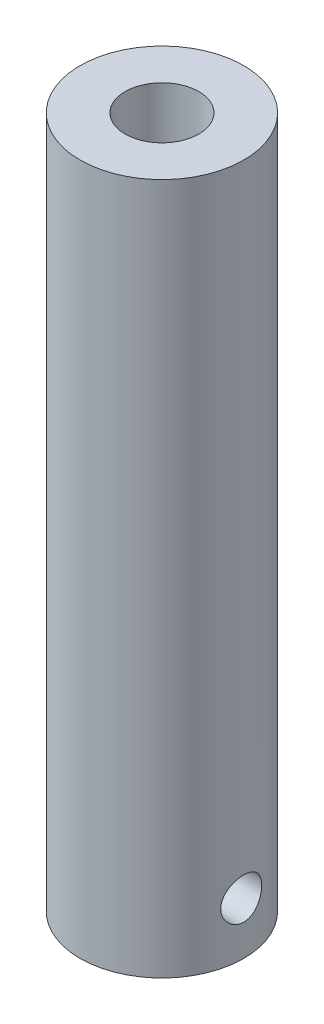
ISO-10303-21;
HEADER;
FILE_DESCRIPTION(('STEP AP214'),'2;1');
FILE_NAME('part.step','',(''),(''),'','','');
FILE_SCHEMA(('AUTOMOTIVE_DESIGN { 1 0 10303 214 1 1 1 1 }'));
ENDSEC;
DATA;
#1=APPLICATION_CONTEXT('core data for automotive mechanical design processes');
#2=APPLICATION_PROTOCOL_DEFINITION('international standard','automotive_design',2000,#1);
#3=PRODUCT_CONTEXT('',#1,'mechanical');
#4=PRODUCT('Part','Part','',(#3));
#5=PRODUCT_RELATED_PRODUCT_CATEGORY('part','',(#4));
#6=PRODUCT_DEFINITION_FORMATION('','',#4);
#7=PRODUCT_DEFINITION_CONTEXT('part definition',#1,'design');
#8=PRODUCT_DEFINITION('design','',#6,#7);
#9=PRODUCT_DEFINITION_SHAPE('','',#8);
#10=(LENGTH_UNIT() NAMED_UNIT(*) SI_UNIT(.MILLI.,.METRE.));
#11=(NAMED_UNIT(*) PLANE_ANGLE_UNIT() SI_UNIT($,.RADIAN.));
#12=(NAMED_UNIT(*) SI_UNIT($,.STERADIAN.) SOLID_ANGLE_UNIT());
#13=UNCERTAINTY_MEASURE_WITH_UNIT(LENGTH_MEASURE(1.E-05),#10,'distance_accuracy_value','');
#14=(GEOMETRIC_REPRESENTATION_CONTEXT(3) GLOBAL_UNCERTAINTY_ASSIGNED_CONTEXT((#13)) GLOBAL_UNIT_ASSIGNED_CONTEXT((#10,
#11,#12)) REPRESENTATION_CONTEXT('',''));
#15=CARTESIAN_POINT('',(0.,0.,0.));
#16=DIRECTION('',(0.,0.,1.));
#17=DIRECTION('',(1.,0.,0.));
#18=AXIS2_PLACEMENT_3D('',#15,#16,#17);
#19=CARTESIAN_POINT('',(0.,16.9,0.));
#20=DIRECTION('',(0.,-1.,0.));
#21=DIRECTION('',(0.,0.,-1.));
#22=AXIS2_PLACEMENT_3D('',#19,#20,#21);
#23=CYLINDRICAL_SURFACE('',#22,2.);
#24=CARTESIAN_POINT('',(-2.,0.76886534867765,0.));
#25=CARTESIAN_POINT('',(-1.99999953289338,0.768866123923703,-0.0276253628899104));
#26=CARTESIAN_POINT('',(-1.99942192710609,0.771162532268913,-0.0552593859435878));
#27=CARTESIAN_POINT('',(-1.99717371276631,0.780273732446652,-0.109735441256844));
#28=CARTESIAN_POINT('',(-1.99550248473323,0.787091085190266,-0.13657701562358));
#29=CARTESIAN_POINT('',(-1.99125208777347,0.805011766498346,-0.188673624060859));
#30=CARTESIAN_POINT('',(-1.98867400947362,0.816109948249409,-0.213930521143334));
#31=CARTESIAN_POINT('',(-1.98288447935864,0.842259145359261,-0.262224043968142));
#32=CARTESIAN_POINT('',(-1.97967300618017,0.857310294050629,-0.28526059478292));
#33=CARTESIAN_POINT('',(-1.97289137863934,0.891265611895721,-0.328933975766973));
#34=CARTESIAN_POINT('',(-1.96931569049511,0.910235873664043,-0.34951856335369));
#35=CARTESIAN_POINT('',(-1.96224540039176,0.951349416980623,-0.387249642401101));
#36=CARTESIAN_POINT('',(-1.95875080762783,0.973493056326483,-0.404395745649712));
#37=CARTESIAN_POINT('',(-1.9521825856657,1.0207304242568,-0.435008847599677));
#38=CARTESIAN_POINT('',(-1.94911598156868,1.04586309228112,-0.448417405308452));
#39=CARTESIAN_POINT('',(-1.94383164937408,1.09811481923044,-0.470798969516842));
#40=CARTESIAN_POINT('',(-1.94161378557596,1.12523355978624,-0.479772685146444));
#41=CARTESIAN_POINT('',(-1.93833492239184,1.18011318141181,-0.492851612268097));
#42=CARTESIAN_POINT('',(-1.93725163691809,1.20785031402758,-0.497050756111113));
#43=CARTESIAN_POINT('',(-1.9362978751258,1.26365487168231,-0.500753925022617));
#44=CARTESIAN_POINT('',(-1.93642720149548,1.29172224224385,-0.500258713939326));
#45=CARTESIAN_POINT('',(-1.93786401832206,1.34667061792581,-0.49466217487976));
#46=CARTESIAN_POINT('',(-1.93914287667293,1.37356388916602,-0.489672780063507));
#47=CARTESIAN_POINT('',(-1.94268903225495,1.42611903231475,-0.475408062301036));
#48=CARTESIAN_POINT('',(-1.94495639990232,1.45178081635398,-0.466132434023141));
#49=CARTESIAN_POINT('',(-1.95025037968062,1.50144468742834,-0.443463159312385));
#50=CARTESIAN_POINT('',(-1.95328442489807,1.52542740594083,-0.430028889077637));
#51=CARTESIAN_POINT('',(-1.95976570282129,1.57083825192993,-0.399452092004985));
#52=CARTESIAN_POINT('',(-1.96321300778245,1.59226593136674,-0.382308916269613));
#53=CARTESIAN_POINT('',(-1.9702529351326,1.63259988724245,-0.344221141560406));
#54=CARTESIAN_POINT('',(-1.9738468982599,1.65141684536477,-0.323182086055287));
#55=CARTESIAN_POINT('',(-1.98068655192929,1.68527242949895,-0.278203972501233));
#56=CARTESIAN_POINT('',(-1.98393223183138,1.70031094009884,-0.254264825902648));
#57=CARTESIAN_POINT('',(-1.98972577364727,1.72621554408578,-0.204038629560464));
#58=CARTESIAN_POINT('',(-1.99227120042575,1.73706712876246,-0.177743797736208));
#59=CARTESIAN_POINT('',(-1.99635972330473,1.75417111724751,-0.123625336047628));
#60=CARTESIAN_POINT('',(-1.99790301113094,1.76042440081703,-0.0958019997168283));
#61=CARTESIAN_POINT('',(-1.99978499757125,1.7680178705306,-0.040179990130009));
#62=CARTESIAN_POINT('',(-2.00015351169426,1.76947969070275,-0.0123989066627367));
#63=CARTESIAN_POINT('',(-1.9997293493815,1.76778234799249,0.0430109582671693));
#64=CARTESIAN_POINT('',(-1.99893677747282,1.76462360107794,0.0706397532148649));
#65=CARTESIAN_POINT('',(-1.99629860375786,1.75387504588052,0.124538089592164));
#66=CARTESIAN_POINT('',(-1.99446878061937,1.74635159418532,0.150821706322918));
#67=CARTESIAN_POINT('',(-1.98996235544711,1.72716298733483,0.201752430817504));
#68=CARTESIAN_POINT('',(-1.98728566789964,1.71549741390659,0.226399373010878));
#69=CARTESIAN_POINT('',(-1.98131102642103,1.68811997238607,0.273841044809949));
#70=CARTESIAN_POINT('',(-1.97800289122311,1.67233997787873,0.29659514727861));
#71=CARTESIAN_POINT('',(-1.97114836395806,1.63726871241199,0.339175537881082));
#72=CARTESIAN_POINT('',(-1.96760193083902,1.61797683547201,0.359001319657669));
#73=CARTESIAN_POINT('',(-1.96056318986924,1.57586469506283,0.39566352269091));
#74=CARTESIAN_POINT('',(-1.95707434729094,1.55296944767684,0.412414622540677));
#75=CARTESIAN_POINT('',(-1.95064292792413,1.50462113718908,0.441836919670899));
#76=CARTESIAN_POINT('',(-1.94770032689009,1.47916818769107,0.454508298052645));
#77=CARTESIAN_POINT('',(-1.94272698244888,1.42656344120662,0.475317140203097));
#78=CARTESIAN_POINT('',(-1.94069085097302,1.39942280589631,0.483481465551355));
#79=CARTESIAN_POINT('',(-1.93775581363394,1.34409546938128,0.495115219984593));
#80=CARTESIAN_POINT('',(-1.93685665906645,1.31590899833349,0.498585675826219));
#81=CARTESIAN_POINT('',(-1.93631633734652,1.26015834072592,0.500679530111331));
#82=CARTESIAN_POINT('',(-1.93663977576088,1.23259953696941,0.499439299260039));
#83=CARTESIAN_POINT('',(-1.93842636335948,1.17809738578832,0.492459092770956));
#84=CARTESIAN_POINT('',(-1.93988948963952,1.15115402600643,0.486719207562256));
#85=CARTESIAN_POINT('',(-1.94377086894241,1.09879586232251,0.470977106480931));
#86=CARTESIAN_POINT('',(-1.94618338412103,1.07337291359758,0.461000468226792));
#87=CARTESIAN_POINT('',(-1.95169251908276,1.02454355443975,0.437088304535024));
#88=CARTESIAN_POINT('',(-1.95478923373591,1.00113742428201,0.423152230011396));
#89=CARTESIAN_POINT('',(-1.96141878087837,0.95634713901031,0.391289249545712));
#90=CARTESIAN_POINT('',(-1.96496088277252,0.935031657536331,0.373267720970752));
#91=CARTESIAN_POINT('',(-1.97202675748762,0.895683000412515,0.333929790396579));
#92=CARTESIAN_POINT('',(-1.97555052575687,0.877650605306661,0.312612607087049));
#93=CARTESIAN_POINT('',(-1.98225885215888,0.845061579156115,0.266822528900863));
#94=CARTESIAN_POINT('',(-1.98543611121956,0.830573810787124,0.242299474105462));
#95=CARTESIAN_POINT('',(-1.99101641658373,0.805949527697474,0.191088686503492));
#96=CARTESIAN_POINT('',(-1.9934200173326,0.795809895128138,0.16440252114558));
#97=CARTESIAN_POINT('',(-1.99682686521847,0.781674738567766,0.114803417747824));
#98=CARTESIAN_POINT('',(-1.9980086168423,0.776881600993172,0.0921267236360227));
#99=CARTESIAN_POINT('',(-1.99959535077316,0.77047670080367,0.0463020238454276));
#100=CARTESIAN_POINT('',(-2.00000039150298,0.768864698909216,0.0231540537475387));
#101=CARTESIAN_POINT('',(-2.,0.76886534867765,0.));
#102=B_SPLINE_CURVE_WITH_KNOTS('',3,(#24,#25,#26,#27,#28,#29,#30,#31,#32,#33,#34,#35,#36,#37,
#38,#39,#40,#41,#42,#43,#44,#45,#46,#47,#48,#49,#50,#51,#52,#53,#54,#55,#56,#57,#58,#59,#60,#61,
#62,#63,#64,#65,#66,#67,#68,#69,#70,#71,#72,#73,#74,#75,#76,#77,#78,#79,#80,#81,#82,#83,#84,#85,
#86,#87,#88,#89,#90,#91,#92,#93,#94,#95,#96,#97,#98,#99,#100,#101),.UNSPECIFIED.,.T.,.F.,(4,2,2,
2,2,2,2,2,2,2,2,2,2,2,2,2,2,2,2,2,2,2,2,2,2,2,2,2,2,2,2,2,2,2,2,2,2,2,4),(0.,0.0827912374906299,
0.165629412587966,0.248368300762035,0.331109980056442,0.41538145145713,0.499662431933539,
0.585195491819356,0.670714870564561,0.754520983664768,0.838313460375656,0.920074990023393,
1.00184234488679,1.08443509291293,1.16704230278721,1.25200500323006,1.33697029852749,
1.42222743003038,1.50746824562881,1.59052769649759,1.67357967037581,1.75540091504679,
1.83723042440763,1.92051195855117,2.0038078766934,2.08914836401492,2.17448506249836,
2.25930751538012,2.34411141084136,2.42647926799537,2.50884546985345,2.59072133519816,
2.67260856045634,2.75663192136637,2.84067523256806,2.92624061833196,3.01174454607117,
3.08114080980716,3.1505318534768),.UNSPECIFIED.);
#103=CARTESIAN_POINT('',(-2.,0.76886534867765,0.));
#104=VERTEX_POINT('',#103);
#105=EDGE_CURVE('E10',#104,#104,#102,.T.);
#106=ORIENTED_EDGE('',*,*,#105,.T.);
#107=EDGE_LOOP('',(#106));
#108=FACE_BOUND('',#107,.T.);
#109=CARTESIAN_POINT('',(1.93649167310371,1.26886534867765,-0.5));
#110=CARTESIAN_POINT('',(1.93649220028592,1.24125519849926,-0.49999921571935));
#111=CARTESIAN_POINT('',(1.93708861249639,1.21363636896197,-0.497705249104035));
#112=CARTESIAN_POINT('',(1.93940372446125,1.15919183306134,-0.488604625097223));
#113=CARTESIAN_POINT('',(1.9411230773709,1.13236659778767,-0.481795341349039));
#114=CARTESIAN_POINT('',(1.94547744906506,1.08030464103373,-0.463898239924817));
#115=CARTESIAN_POINT('',(1.9481112853468,1.05506591759877,-0.452815945570472));
#116=CARTESIAN_POINT('',(1.95399638409164,1.00680317817141,-0.426704228252703));
#117=CARTESIAN_POINT('',(1.9572476727662,0.983779256262077,-0.411674637712252));
#118=CARTESIAN_POINT('',(1.96408143270184,0.940093019624728,-0.377741685462259));
#119=CARTESIAN_POINT('',(1.96766919524355,0.919486628607513,-0.358767377540779));
#120=CARTESIAN_POINT('',(1.97472575103311,0.881713069805711,-0.317636412820164));
#121=CARTESIAN_POINT('',(1.97819453313346,0.864546223553336,-0.29547945883607));
#122=CARTESIAN_POINT('',(1.98468083104048,0.83391025515136,-0.248229040215782));
#123=CARTESIAN_POINT('',(1.987691374801,0.820496071045348,-0.223098915239022));
#124=CARTESIAN_POINT('',(1.99286162385215,0.798103419847043,-0.170852636858555));
#125=CARTESIAN_POINT('',(1.99502145466874,0.78912429829455,-0.143736777158389));
#126=CARTESIAN_POINT('',(1.99820951769631,0.776035781761931,-0.088871751750832));
#127=CARTESIAN_POINT('',(1.99925978768862,0.771831419812333,-0.0611465439097952));
#128=CARTESIAN_POINT('',(2.00018718821461,0.76811367282254,-0.00536576385255426));
#129=CARTESIAN_POINT('',(2.00006449219341,0.768599594235731,0.0226897589076134));
#130=CARTESIAN_POINT('',(1.99867618990707,0.774180318727679,0.0776761235861935));
#131=CARTESIAN_POINT('',(1.99743600468175,0.779172613688421,0.104618107800533));
#132=CARTESIAN_POINT('',(1.99398167304971,0.79345960268735,0.157269123706843));
#133=CARTESIAN_POINT('',(1.99176747479688,0.802754525753132,0.182978089685219));
#134=CARTESIAN_POINT('',(1.98657501940179,0.825465862815063,0.232703351750903));
#135=CARTESIAN_POINT('',(1.98359003939011,0.83891875761,0.256702254883252));
#136=CARTESIAN_POINT('',(1.9771798076193,0.869536484500902,0.302137811170244));
#137=CARTESIAN_POINT('',(1.97375447930498,0.886701962389774,0.323574017542753));
#138=CARTESIAN_POINT('',(1.96672742753904,0.924807097074125,0.363887017542478));
#139=CARTESIAN_POINT('',(1.96312343905184,0.945836327147205,0.382678839537599));
#140=CARTESIAN_POINT('',(1.95623008703341,0.9907853433857,0.416488187981509));
#141=CARTESIAN_POINT('',(1.95294073821194,1.01470526457585,0.431505538023008));
#142=CARTESIAN_POINT('',(1.9470409936633,1.06492335550744,0.457394064511299));
#143=CARTESIAN_POINT('',(1.94443396745144,1.09123249474029,0.468244783485245));
#144=CARTESIAN_POINT('',(1.94023728027991,1.14538244229294,0.48534281031817));
#145=CARTESIAN_POINT('',(1.93864740162044,1.17322292147428,0.491591103276455));
#146=CARTESIAN_POINT('',(1.93671071207828,1.22885724898227,0.499165927733035));
#147=CARTESIAN_POINT('',(1.9363321781873,1.25663290734358,0.500618094783926));
#148=CARTESIAN_POINT('',(1.93677468696208,1.31202973599328,0.498903398103109));
#149=CARTESIAN_POINT('',(1.93759561920253,1.3396509202679,0.49573695956976));
#150=CARTESIAN_POINT('',(1.94031416390912,1.39348820166859,0.484985092787532));
#151=CARTESIAN_POINT('',(1.94219394046875,1.41971989399182,0.477472813656349));
#152=CARTESIAN_POINT('',(1.94680143654192,1.47055164024799,0.458323616334124));
#153=CARTESIAN_POINT('',(1.94952925649723,1.49515150048872,0.446686209542509));
#154=CARTESIAN_POINT('',(1.95559227418653,1.54255360425112,0.419354133587311));
#155=CARTESIAN_POINT('',(1.95893833721328,1.56531111668627,0.403584350767126));
#156=CARTESIAN_POINT('',(1.96583416614343,1.60790302123792,0.368530146467228));
#157=CARTESIAN_POINT('',(1.96938396545694,1.62773693200766,0.34924514740272));
#158=CARTESIAN_POINT('',(1.97639480606321,1.66442755719184,0.307131360492363));
#159=CARTESIAN_POINT('',(1.97985140412367,1.68119736118741,0.284225976265796));
#160=CARTESIAN_POINT('',(1.98619443322747,1.7106525220679,0.235851341347338));
#161=CARTESIAN_POINT('',(1.98908089400792,1.72333809199929,0.210382224478796));
#162=CARTESIAN_POINT('',(1.99394023147663,1.74415455558324,0.157779100865545));
#163=CARTESIAN_POINT('',(1.99591966004482,1.75231820555346,0.130658690513941));
#164=CARTESIAN_POINT('',(1.99877058679158,1.76395741559933,0.075374880159404));
#165=CARTESIAN_POINT('',(1.99964229878682,1.76743388042546,0.0472116825206219));
#166=CARTESIAN_POINT('',(2.00017084704406,1.76954914346542,-0.0085417632216629));
#167=CARTESIAN_POINT('',(1.99985989440004,1.76831620322535,-0.0361269134830162));
#168=CARTESIAN_POINT('',(1.99812948228712,1.76134143503048,-0.0906837482073695));
#169=CARTESIAN_POINT('',(1.99671005578547,1.7555997411711,-0.117655450890443));
#170=CARTESIAN_POINT('',(1.99292716426982,1.73983923879219,-0.170085517822408));
#171=CARTESIAN_POINT('',(1.99056882251334,1.72984362202034,-0.195551247290509));
#172=CARTESIAN_POINT('',(1.98515644456691,1.70588005916799,-0.244458526520734));
#173=CARTESIAN_POINT('',(1.98210232068864,1.69191161234287,-0.267899820632525));
#174=CARTESIAN_POINT('',(1.97553624840671,1.66000773167912,-0.31270096421195));
#175=CARTESIAN_POINT('',(1.97201508472823,1.64198527722397,-0.333997494150293));
#176=CARTESIAN_POINT('',(1.96495324526603,1.60265392269075,-0.373307510135626));
#177=CARTESIAN_POINT('',(1.96141256476212,1.58134419062868,-0.391320162534089));
#178=CARTESIAN_POINT('',(1.95463737930341,1.535564641577,-0.42388101323962));
#179=CARTESIAN_POINT('',(1.95140981865195,1.51104328697141,-0.438358309723296));
#180=CARTESIAN_POINT('',(1.94571977775055,1.45983760371623,-0.462963448307811));
#181=CARTESIAN_POINT('',(1.94325674122407,1.43315486562401,-0.473094454879778));
#182=CARTESIAN_POINT('',(1.93975954370657,1.38357684276451,-0.487211264282786));
#183=CARTESIAN_POINT('',(1.93854331502881,1.36091876648647,-0.491996585297914));
#184=CARTESIAN_POINT('',(1.93690919290179,1.31513091417692,-0.49839114628641));
#185=CARTESIAN_POINT('',(1.93649123135319,1.29200117855234,-0.500000657185259));
#186=CARTESIAN_POINT('',(1.93649167310371,1.26886534867765,-0.5));
#187=B_SPLINE_CURVE_WITH_KNOTS('',3,(#109,#110,#111,#112,#113,#114,#115,#116,#117,#118,#119,
#120,#121,#122,#123,#124,#125,#126,#127,#128,#129,#130,#131,#132,#133,#134,#135,#136,#137,#138,
#139,#140,#141,#142,#143,#144,#145,#146,#147,#148,#149,#150,#151,#152,#153,#154,#155,#156,#157,
#158,#159,#160,#161,#162,#163,#164,#165,#166,#167,#168,#169,#170,#171,#172,#173,#174,#175,#176,
#177,#178,#179,#180,#181,#182,#183,#184,#185,#186),.UNSPECIFIED.,.T.,.F.,(4,2,2,2,2,2,2,2,2,2,2,
2,2,2,2,2,2,2,2,2,2,2,2,2,2,2,2,2,2,2,2,2,2,2,2,2,2,2,4),(0.,0.082745488337615,
0.165539148267105,0.248226145414576,0.330916653492329,0.415247908367324,0.499587042941105,
0.585102992777212,0.670606319675556,0.754377501972065,0.838136297313413,0.920036525359266,
1.00194111343094,1.08458574849026,1.1672447709192,1.2521409331252,1.33704106238098,
1.42235286399818,1.50764640024047,1.59068714950481,1.67372025434898,1.75539480999979,
1.83707904282421,1.92036569169969,2.00366603775146,2.08905066191201,2.17443083142048,
2.25918414559523,2.34392109779945,2.42636689223628,2.50881023473533,2.59080975310079,
2.67281961145752,2.75679419314551,2.84079006311239,2.92635295455073,3.01185344271461,
3.08119565433603,3.15053195018041),.UNSPECIFIED.);
#188=CARTESIAN_POINT('',(1.93649167310371,1.26886534867765,-0.5));
#189=VERTEX_POINT('',#188);
#190=EDGE_CURVE('E41',#189,#189,#187,.T.);
#191=ORIENTED_EDGE('',*,*,#190,.T.);
#192=EDGE_LOOP('',(#191));
#193=FACE_BOUND('',#192,.T.);
#194=CARTESIAN_POINT('',(0.,16.9,0.));
#195=DIRECTION('',(0.,1.,0.));
#196=DIRECTION('',(0.,0.,1.));
#197=AXIS2_PLACEMENT_3D('',#194,#195,#196);
#198=CIRCLE('',#197,2.);
#199=CARTESIAN_POINT('',(0.,16.9,2.));
#200=VERTEX_POINT('',#199);
#201=EDGE_CURVE('E45',#200,#200,#198,.T.);
#202=ORIENTED_EDGE('',*,*,#201,.F.);
#203=EDGE_LOOP('',(#202));
#204=FACE_BOUND('',#203,.T.);
#205=CARTESIAN_POINT('',(0.,0.,0.));
#206=DIRECTION('',(0.,1.,0.));
#207=DIRECTION('',(0.,0.,1.));
#208=AXIS2_PLACEMENT_3D('',#205,#206,#207);
#209=CIRCLE('',#208,2.);
#210=CARTESIAN_POINT('',(0.,0.,2.));
#211=VERTEX_POINT('',#210);
#212=EDGE_CURVE('E49',#211,#211,#209,.T.);
#213=ORIENTED_EDGE('',*,*,#212,.T.);
#214=EDGE_LOOP('',(#213));
#215=FACE_BOUND('',#214,.T.);
#216=ADVANCED_FACE('F31',(#108,#193,#204,#215),#23,.T.);
#217=CARTESIAN_POINT('',(0.,16.9,0.));
#218=DIRECTION('',(0.,1.,0.));
#219=DIRECTION('',(0.,0.,1.));
#220=AXIS2_PLACEMENT_3D('',#217,#218,#219);
#221=PLANE('',#220);
#222=CARTESIAN_POINT('',(0.,16.9,0.));
#223=DIRECTION('',(0.,1.,0.));
#224=DIRECTION('',(0.,0.,1.));
#225=AXIS2_PLACEMENT_3D('',#222,#223,#224);
#226=CIRCLE('',#225,0.9);
#227=CARTESIAN_POINT('',(0.,16.9,0.9));
#228=VERTEX_POINT('',#227);
#229=EDGE_CURVE('E88',#228,#228,#226,.T.);
#230=ORIENTED_EDGE('',*,*,#229,.F.);
#231=EDGE_LOOP('',(#230));
#232=FACE_BOUND('',#231,.T.);
#233=ORIENTED_EDGE('',*,*,#201,.T.);
#234=EDGE_LOOP('',(#233));
#235=FACE_BOUND('',#234,.T.);
#236=ADVANCED_FACE('F69',(#232,#235),#221,.T.);
#237=CARTESIAN_POINT('',(0.,0.,0.));
#238=DIRECTION('',(0.,1.,0.));
#239=DIRECTION('',(0.,0.,1.));
#240=AXIS2_PLACEMENT_3D('',#237,#238,#239);
#241=PLANE('',#240);
#242=ORIENTED_EDGE('',*,*,#212,.F.);
#243=EDGE_LOOP('',(#242));
#244=FACE_BOUND('',#243,.T.);
#245=ADVANCED_FACE('F67',(#244),#241,.F.);
#246=CARTESIAN_POINT('',(0.,6.9,0.));
#247=DIRECTION('',(0.,1.,0.));
#248=DIRECTION('',(0.,0.,1.));
#249=AXIS2_PLACEMENT_3D('',#246,#247,#248);
#250=CYLINDRICAL_SURFACE('',#249,0.9);
#251=CARTESIAN_POINT('',(0.,6.9,0.));
#252=DIRECTION('',(0.,1.,0.));
#253=DIRECTION('',(0.,0.,1.));
#254=AXIS2_PLACEMENT_3D('',#251,#252,#253);
#255=CIRCLE('',#254,0.9);
#256=CARTESIAN_POINT('',(0.,6.9,0.9));
#257=VERTEX_POINT('',#256);
#258=EDGE_CURVE('E86',#257,#257,#255,.T.);
#259=ORIENTED_EDGE('',*,*,#258,.F.);
#260=EDGE_LOOP('',(#259));
#261=FACE_BOUND('',#260,.T.);
#262=ORIENTED_EDGE('',*,*,#229,.T.);
#263=EDGE_LOOP('',(#262));
#264=FACE_BOUND('',#263,.T.);
#265=ADVANCED_FACE('F63',(#261,#264),#250,.F.);
#266=CARTESIAN_POINT('',(0.,6.9,0.));
#267=DIRECTION('',(0.,1.,0.));
#268=DIRECTION('',(0.,0.,1.));
#269=AXIS2_PLACEMENT_3D('',#266,#267,#268);
#270=PLANE('',#269);
#271=ORIENTED_EDGE('',*,*,#258,.T.);
#272=EDGE_LOOP('',(#271));
#273=FACE_BOUND('',#272,.T.);
#274=ADVANCED_FACE('F58',(#273),#270,.T.);
#275=CARTESIAN_POINT('',(-2.,1.26886534867765,0.));
#276=DIRECTION('',(1.,0.,0.));
#277=DIRECTION('',(0.,0.,-1.));
#278=AXIS2_PLACEMENT_3D('',#275,#276,#277);
#279=CYLINDRICAL_SURFACE('',#278,0.5);
#280=ORIENTED_EDGE('',*,*,#190,.F.);
#281=EDGE_LOOP('',(#280));
#282=FACE_BOUND('',#281,.T.);
#283=ORIENTED_EDGE('',*,*,#105,.F.);
#284=EDGE_LOOP('',(#283));
#285=FACE_BOUND('',#284,.T.);
#286=ADVANCED_FACE('F54',(#282,#285),#279,.F.);
#287=CLOSED_SHELL('',(#216,#236,#245,#265,#274,#286));
#288=MANIFOLD_SOLID_BREP('B2',#287);
#289=ADVANCED_BREP_SHAPE_REPRESENTATION('',(#18,#288),#14);
#290=SHAPE_DEFINITION_REPRESENTATION(#9,#289);
ENDSEC;
END-ISO-10303-21;
